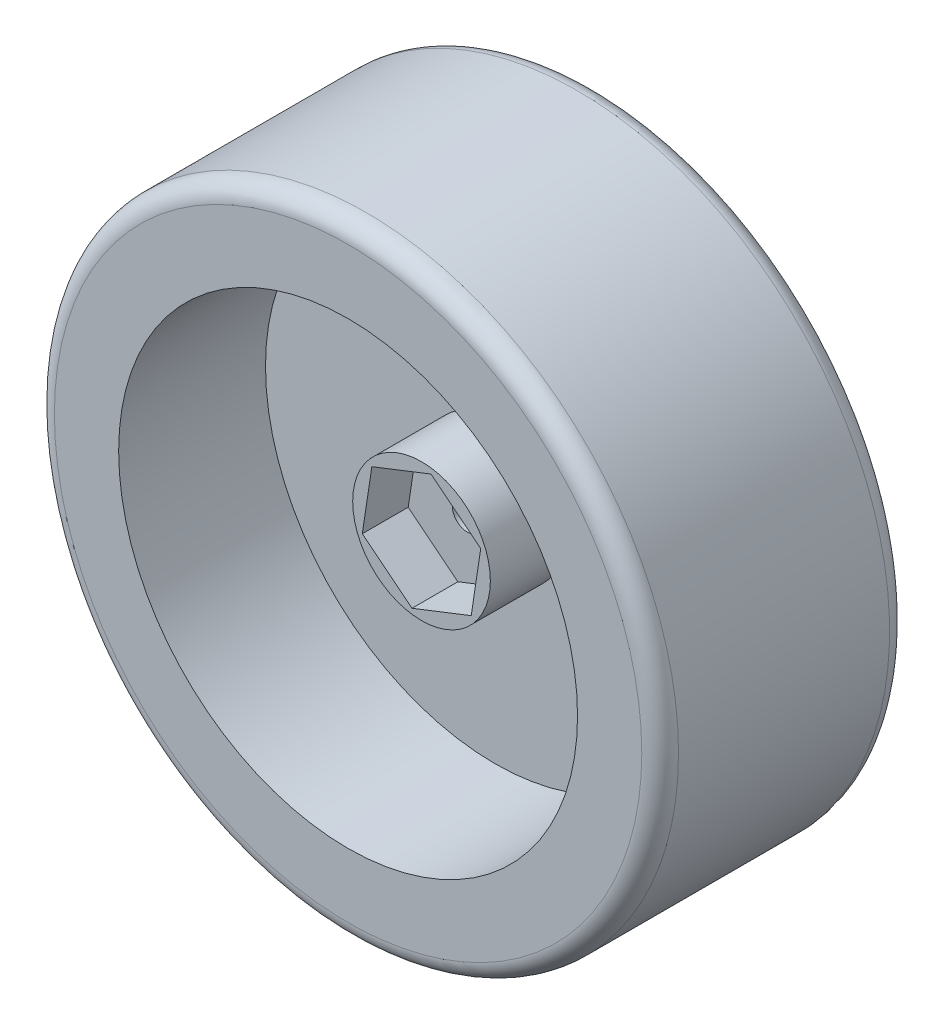
ISO-10303-21;
HEADER;
FILE_DESCRIPTION(('STEP AP214'),'2;1');
FILE_NAME('part.step','',(''),(''),'','','');
FILE_SCHEMA(('AUTOMOTIVE_DESIGN { 1 0 10303 214 1 1 1 1 }'));
ENDSEC;
DATA;
#1=APPLICATION_CONTEXT('core data for automotive mechanical design processes');
#2=APPLICATION_PROTOCOL_DEFINITION('international standard','automotive_design',2000,#1);
#3=PRODUCT_CONTEXT('',#1,'mechanical');
#4=PRODUCT('Part','Part','',(#3));
#5=PRODUCT_RELATED_PRODUCT_CATEGORY('part','',(#4));
#6=PRODUCT_DEFINITION_FORMATION('','',#4);
#7=PRODUCT_DEFINITION_CONTEXT('part definition',#1,'design');
#8=PRODUCT_DEFINITION('design','',#6,#7);
#9=PRODUCT_DEFINITION_SHAPE('','',#8);
#10=(LENGTH_UNIT() NAMED_UNIT(*) SI_UNIT(.MILLI.,.METRE.));
#11=(NAMED_UNIT(*) PLANE_ANGLE_UNIT() SI_UNIT($,.RADIAN.));
#12=(NAMED_UNIT(*) SI_UNIT($,.STERADIAN.) SOLID_ANGLE_UNIT());
#13=UNCERTAINTY_MEASURE_WITH_UNIT(LENGTH_MEASURE(1.E-05),#10,'distance_accuracy_value','');
#14=(GEOMETRIC_REPRESENTATION_CONTEXT(3) GLOBAL_UNCERTAINTY_ASSIGNED_CONTEXT((#13)) GLOBAL_UNIT_ASSIGNED_CONTEXT((#10,
#11,#12)) REPRESENTATION_CONTEXT('',''));
#15=CARTESIAN_POINT('',(0.,0.,0.));
#16=DIRECTION('',(0.,0.,1.));
#17=DIRECTION('',(1.,0.,0.));
#18=AXIS2_PLACEMENT_3D('',#15,#16,#17);
#19=CARTESIAN_POINT('',(0.,0.,27.));
#20=DIRECTION('',(0.,0.,-1.));
#21=DIRECTION('',(-1.,0.,0.));
#22=AXIS2_PLACEMENT_3D('',#19,#20,#21);
#23=CYLINDRICAL_SURFACE('',#22,34.);
#24=CARTESIAN_POINT('',(0.,0.,25.));
#25=DIRECTION('',(0.,0.,1.));
#26=DIRECTION('',(1.,0.,0.));
#27=AXIS2_PLACEMENT_3D('',#24,#25,#26);
#28=CIRCLE('',#27,34.);
#29=CARTESIAN_POINT('',(34.,0.,25.));
#30=VERTEX_POINT('',#29);
#31=EDGE_CURVE('E11',#30,#30,#28,.F.);
#32=ORIENTED_EDGE('',*,*,#31,.T.);
#33=EDGE_LOOP('',(#32));
#34=FACE_BOUND('',#33,.T.);
#35=CARTESIAN_POINT('',(0.,0.,2.));
#36=DIRECTION('',(0.,0.,-1.));
#37=DIRECTION('',(-1.,0.,0.));
#38=AXIS2_PLACEMENT_3D('',#35,#36,#37);
#39=CIRCLE('',#38,34.);
#40=CARTESIAN_POINT('',(-34.,0.,2.));
#41=VERTEX_POINT('',#40);
#42=EDGE_CURVE('E24',#41,#41,#39,.F.);
#43=ORIENTED_EDGE('',*,*,#42,.T.);
#44=EDGE_LOOP('',(#43));
#45=FACE_BOUND('',#44,.T.);
#46=ADVANCED_FACE('F17',(#34,#45),#23,.T.);
#47=CARTESIAN_POINT('',(34.,0.,27.));
#48=DIRECTION('',(0.,0.,1.));
#49=DIRECTION('',(1.,0.,0.));
#50=AXIS2_PLACEMENT_3D('',#47,#48,#49);
#51=PLANE('',#50);
#52=CARTESIAN_POINT('',(0.,0.,27.));
#53=DIRECTION('',(0.,0.,1.));
#54=DIRECTION('',(1.,0.,0.));
#55=AXIS2_PLACEMENT_3D('',#52,#53,#54);
#56=CIRCLE('',#55,32.);
#57=CARTESIAN_POINT('',(32.,0.,27.));
#58=VERTEX_POINT('',#57);
#59=EDGE_CURVE('E146',#58,#58,#56,.T.);
#60=ORIENTED_EDGE('',*,*,#59,.T.);
#61=EDGE_LOOP('',(#60));
#62=FACE_BOUND('',#61,.T.);
#63=CARTESIAN_POINT('',(0.,0.,27.));
#64=DIRECTION('',(0.,0.,1.));
#65=DIRECTION('',(1.,0.,0.));
#66=AXIS2_PLACEMENT_3D('',#63,#64,#65);
#67=CIRCLE('',#66,25.);
#68=CARTESIAN_POINT('',(25.,0.,27.));
#69=VERTEX_POINT('',#68);
#70=EDGE_CURVE('E143',#69,#69,#67,.T.);
#71=ORIENTED_EDGE('',*,*,#70,.F.);
#72=EDGE_LOOP('',(#71));
#73=FACE_BOUND('',#72,.T.);
#74=ADVANCED_FACE('F163',(#62,#73),#51,.T.);
#75=CARTESIAN_POINT('',(0.,0.,0.));
#76=DIRECTION('',(0.,0.,-1.));
#77=DIRECTION('',(-1.,0.,0.));
#78=AXIS2_PLACEMENT_3D('',#75,#76,#77);
#79=PLANE('',#78);
#80=CARTESIAN_POINT('',(0.,0.,0.));
#81=DIRECTION('',(0.,0.,-1.));
#82=DIRECTION('',(-1.,0.,0.));
#83=AXIS2_PLACEMENT_3D('',#80,#81,#82);
#84=CIRCLE('',#83,32.);
#85=CARTESIAN_POINT('',(-32.,0.,0.));
#86=VERTEX_POINT('',#85);
#87=EDGE_CURVE('E140',#86,#86,#84,.T.);
#88=ORIENTED_EDGE('',*,*,#87,.T.);
#89=EDGE_LOOP('',(#88));
#90=FACE_BOUND('',#89,.T.);
#91=CARTESIAN_POINT('',(0.,0.,0.));
#92=DIRECTION('',(0.,0.,-1.));
#93=DIRECTION('',(-1.,0.,0.));
#94=AXIS2_PLACEMENT_3D('',#91,#92,#93);
#95=CIRCLE('',#94,13.9999999999994);
#96=CARTESIAN_POINT('',(-13.9999999999994,0.,0.));
#97=VERTEX_POINT('',#96);
#98=EDGE_CURVE('E137',#97,#97,#95,.T.);
#99=ORIENTED_EDGE('',*,*,#98,.F.);
#100=EDGE_LOOP('',(#99));
#101=FACE_BOUND('',#100,.T.);
#102=ADVANCED_FACE('F159',(#90,#101),#79,.T.);
#103=CARTESIAN_POINT('',(0.,0.,11.));
#104=DIRECTION('',(0.,0.,-1.));
#105=DIRECTION('',(-1.,0.,0.));
#106=AXIS2_PLACEMENT_3D('',#103,#104,#105);
#107=PLANE('',#106);
#108=CARTESIAN_POINT('',(0.,0.,11.));
#109=DIRECTION('',(0.,0.,-1.));
#110=DIRECTION('',(-1.,0.,0.));
#111=AXIS2_PLACEMENT_3D('',#108,#109,#110);
#112=CIRCLE('',#111,7.5);
#113=CARTESIAN_POINT('',(-7.5,0.,11.));
#114=VERTEX_POINT('',#113);
#115=EDGE_CURVE('E134',#114,#114,#112,.F.);
#116=ORIENTED_EDGE('',*,*,#115,.F.);
#117=EDGE_LOOP('',(#116));
#118=FACE_BOUND('',#117,.T.);
#119=CARTESIAN_POINT('',(0.,0.,11.));
#120=DIRECTION('',(0.,0.,1.));
#121=DIRECTION('',(1.,0.,0.));
#122=AXIS2_PLACEMENT_3D('',#119,#120,#121);
#123=CIRCLE('',#122,25.);
#124=CARTESIAN_POINT('',(25.,0.,11.));
#125=VERTEX_POINT('',#124);
#126=EDGE_CURVE('E131',#125,#125,#123,.T.);
#127=ORIENTED_EDGE('',*,*,#126,.T.);
#128=EDGE_LOOP('',(#127));
#129=FACE_BOUND('',#128,.T.);
#130=ADVANCED_FACE('F162',(#118,#129),#107,.F.);
#131=CARTESIAN_POINT('',(0.,0.,27.));
#132=DIRECTION('',(0.,0.,1.));
#133=DIRECTION('',(1.,0.,0.));
#134=AXIS2_PLACEMENT_3D('',#131,#132,#133);
#135=CYLINDRICAL_SURFACE('',#134,25.);
#136=ORIENTED_EDGE('',*,*,#126,.F.);
#137=EDGE_LOOP('',(#136));
#138=FACE_BOUND('',#137,.T.);
#139=ORIENTED_EDGE('',*,*,#70,.T.);
#140=EDGE_LOOP('',(#139));
#141=FACE_BOUND('',#140,.T.);
#142=ADVANCED_FACE('F198',(#138,#141),#135,.F.);
#143=CARTESIAN_POINT('',(0.,0.,19.));
#144=DIRECTION('',(0.,0.,-1.));
#145=DIRECTION('',(-1.,0.,0.));
#146=AXIS2_PLACEMENT_3D('',#143,#144,#145);
#147=CYLINDRICAL_SURFACE('',#146,7.5);
#148=CARTESIAN_POINT('',(0.,0.,19.));
#149=DIRECTION('',(0.,0.,1.));
#150=DIRECTION('',(1.,0.,0.));
#151=AXIS2_PLACEMENT_3D('',#148,#149,#150);
#152=CIRCLE('',#151,7.5);
#153=CARTESIAN_POINT('',(7.5,0.,19.));
#154=VERTEX_POINT('',#153);
#155=EDGE_CURVE('E128',#154,#154,#152,.T.);
#156=ORIENTED_EDGE('',*,*,#155,.F.);
#157=EDGE_LOOP('',(#156));
#158=FACE_BOUND('',#157,.T.);
#159=ORIENTED_EDGE('',*,*,#115,.T.);
#160=EDGE_LOOP('',(#159));
#161=FACE_BOUND('',#160,.T.);
#162=ADVANCED_FACE('F202',(#158,#161),#147,.T.);
#163=CARTESIAN_POINT('',(0.,0.,19.));
#164=DIRECTION('',(0.,0.,1.));
#165=DIRECTION('',(1.,0.,0.));
#166=AXIS2_PLACEMENT_3D('',#163,#164,#165);
#167=PLANE('',#166);
#168=DIRECTION('',(-0.931103789340978,-0.364754346752539,0.));
#169=VECTOR('',#168,1.);
#170=CARTESIAN_POINT('',(1.0369120600019,6.85016885775987,19.));
#171=LINE('',#170,#169);
#172=CARTESIAN_POINT('',(1.0369120600019,6.85016885775987,19.));
#173=VERTEX_POINT('',#172);
#174=CARTESIAN_POINT('',(-5.41396422103197,4.32307661433192,19.));
#175=VERTEX_POINT('',#174);
#176=EDGE_CURVE('E31',#173,#175,#171,.T.);
#177=ORIENTED_EDGE('',*,*,#176,.F.);
#178=DIRECTION('',(-0.781438425098979,0.62398236175298,0.));
#179=VECTOR('',#178,1.);
#180=CARTESIAN_POINT('',(6.45087628103396,2.52709224342801,19.));
#181=LINE('',#180,#179);
#182=CARTESIAN_POINT('',(6.45087628103396,2.52709224342801,19.));
#183=VERTEX_POINT('',#182);
#184=EDGE_CURVE('E36',#183,#173,#181,.T.);
#185=ORIENTED_EDGE('',*,*,#184,.F.);
#186=DIRECTION('',(0.149665364242027,0.988736708505506,0.));
#187=VECTOR('',#186,1.);
#188=CARTESIAN_POINT('',(5.41396422103197,-4.32307661433192,19.));
#189=LINE('',#188,#187);
#190=CARTESIAN_POINT('',(5.41396422103197,-4.32307661433192,19.));
#191=VERTEX_POINT('',#190);
#192=EDGE_CURVE('E123',#191,#183,#189,.T.);
#193=ORIENTED_EDGE('',*,*,#192,.F.);
#194=DIRECTION('',(0.931103789340982,0.364754346752528,0.));
#195=VECTOR('',#194,1.);
#196=CARTESIAN_POINT('',(-1.03691206000179,-6.85016885775974,19.));
#197=LINE('',#196,#195);
#198=CARTESIAN_POINT('',(-1.03691206000179,-6.85016885775974,19.));
#199=VERTEX_POINT('',#198);
#200=EDGE_CURVE('E120',#199,#191,#197,.T.);
#201=ORIENTED_EDGE('',*,*,#200,.F.);
#202=DIRECTION('',(0.781438425098994,-0.623982361752961,0.));
#203=VECTOR('',#202,1.);
#204=CARTESIAN_POINT('',(-6.45087628103396,-2.52709224342801,19.));
#205=LINE('',#204,#203);
#206=CARTESIAN_POINT('',(-6.45087628103396,-2.52709224342801,19.));
#207=VERTEX_POINT('',#206);
#208=EDGE_CURVE('E118',#207,#199,#205,.T.);
#209=ORIENTED_EDGE('',*,*,#208,.F.);
#210=DIRECTION('',(-0.149665364242027,-0.988736708505506,0.));
#211=VECTOR('',#210,1.);
#212=CARTESIAN_POINT('',(-5.41396422103197,4.32307661433192,19.));
#213=LINE('',#212,#211);
#214=EDGE_CURVE('E87',#175,#207,#213,.T.);
#215=ORIENTED_EDGE('',*,*,#214,.F.);
#216=EDGE_LOOP('',(#177,#185,#193,#201,#209,#215));
#217=FACE_BOUND('',#216,.T.);
#218=ORIENTED_EDGE('',*,*,#155,.T.);
#219=EDGE_LOOP('',(#218));
#220=FACE_BOUND('',#219,.T.);
#221=ADVANCED_FACE('F206',(#217,#220),#167,.T.);
#222=CARTESIAN_POINT('',(1.0369120600019,6.85016885775987,14.));
#223=DIRECTION('',(-0.364754346752539,0.931103789340978,0.));
#224=DIRECTION('',(-0.931103789340978,-0.364754346752539,0.));
#225=AXIS2_PLACEMENT_3D('',#222,#223,#224);
#226=PLANE('',#225);
#227=ORIENTED_EDGE('',*,*,#176,.T.);
#228=DIRECTION('',(0.,0.,1.));
#229=VECTOR('',#228,1.);
#230=CARTESIAN_POINT('',(-5.41396422103197,4.32307661433192,14.));
#231=LINE('',#230,#229);
#232=CARTESIAN_POINT('',(-5.41396422103197,4.32307661433192,14.));
#233=VERTEX_POINT('',#232);
#234=EDGE_CURVE('E115',#233,#175,#231,.T.);
#235=ORIENTED_EDGE('',*,*,#234,.F.);
#236=DIRECTION('',(-0.931103789340978,-0.364754346752539,0.));
#237=VECTOR('',#236,1.);
#238=CARTESIAN_POINT('',(1.0369120600019,6.85016885775987,14.));
#239=LINE('',#238,#237);
#240=CARTESIAN_POINT('',(1.0369120600019,6.85016885775987,14.));
#241=VERTEX_POINT('',#240);
#242=EDGE_CURVE('E91',#241,#233,#239,.T.);
#243=ORIENTED_EDGE('',*,*,#242,.F.);
#244=DIRECTION('',(0.,0.,1.));
#245=VECTOR('',#244,1.);
#246=CARTESIAN_POINT('',(1.0369120600019,6.85016885775987,14.));
#247=LINE('',#246,#245);
#248=EDGE_CURVE('E112',#241,#173,#247,.T.);
#249=ORIENTED_EDGE('',*,*,#248,.T.);
#250=EDGE_LOOP('',(#227,#235,#243,#249));
#251=FACE_BOUND('',#250,.T.);
#252=ADVANCED_FACE('F210',(#251),#226,.F.);
#253=CARTESIAN_POINT('',(6.45087628103396,2.52709224342801,14.));
#254=DIRECTION('',(0.62398236175298,0.781438425098979,0.));
#255=DIRECTION('',(-0.781438425098979,0.62398236175298,0.));
#256=AXIS2_PLACEMENT_3D('',#253,#254,#255);
#257=PLANE('',#256);
#258=ORIENTED_EDGE('',*,*,#184,.T.);
#259=ORIENTED_EDGE('',*,*,#248,.F.);
#260=DIRECTION('',(-0.781438425098979,0.62398236175298,0.));
#261=VECTOR('',#260,1.);
#262=CARTESIAN_POINT('',(6.45087628103396,2.52709224342801,14.));
#263=LINE('',#262,#261);
#264=CARTESIAN_POINT('',(6.45087628103396,2.52709224342801,14.));
#265=VERTEX_POINT('',#264);
#266=EDGE_CURVE('E110',#265,#241,#263,.T.);
#267=ORIENTED_EDGE('',*,*,#266,.F.);
#268=DIRECTION('',(0.,0.,1.));
#269=VECTOR('',#268,1.);
#270=CARTESIAN_POINT('',(6.45087628103396,2.52709224342801,14.));
#271=LINE('',#270,#269);
#272=EDGE_CURVE('E108',#265,#183,#271,.T.);
#273=ORIENTED_EDGE('',*,*,#272,.T.);
#274=EDGE_LOOP('',(#258,#259,#267,#273));
#275=FACE_BOUND('',#274,.T.);
#276=ADVANCED_FACE('F213',(#275),#257,.F.);
#277=CARTESIAN_POINT('',(5.41396422103197,-4.32307661433192,14.));
#278=DIRECTION('',(0.988736708505506,-0.149665364242027,0.));
#279=DIRECTION('',(0.149665364242027,0.988736708505506,0.));
#280=AXIS2_PLACEMENT_3D('',#277,#278,#279);
#281=PLANE('',#280);
#282=ORIENTED_EDGE('',*,*,#192,.T.);
#283=ORIENTED_EDGE('',*,*,#272,.F.);
#284=DIRECTION('',(0.149665364242027,0.988736708505506,0.));
#285=VECTOR('',#284,1.);
#286=CARTESIAN_POINT('',(5.41396422103197,-4.32307661433192,14.));
#287=LINE('',#286,#285);
#288=CARTESIAN_POINT('',(5.41396422103197,-4.32307661433192,14.));
#289=VERTEX_POINT('',#288);
#290=EDGE_CURVE('E105',#289,#265,#287,.T.);
#291=ORIENTED_EDGE('',*,*,#290,.F.);
#292=DIRECTION('',(0.,0.,1.));
#293=VECTOR('',#292,1.);
#294=CARTESIAN_POINT('',(5.41396422103197,-4.32307661433192,14.));
#295=LINE('',#294,#293);
#296=EDGE_CURVE('E102',#289,#191,#295,.T.);
#297=ORIENTED_EDGE('',*,*,#296,.T.);
#298=EDGE_LOOP('',(#282,#283,#291,#297));
#299=FACE_BOUND('',#298,.T.);
#300=ADVANCED_FACE('F217',(#299),#281,.F.);
#301=CARTESIAN_POINT('',(-1.03691206000179,-6.85016885775974,14.));
#302=DIRECTION('',(0.364754346752528,-0.931103789340982,0.));
#303=DIRECTION('',(0.931103789340982,0.364754346752528,0.));
#304=AXIS2_PLACEMENT_3D('',#301,#302,#303);
#305=PLANE('',#304);
#306=ORIENTED_EDGE('',*,*,#200,.T.);
#307=ORIENTED_EDGE('',*,*,#296,.F.);
#308=DIRECTION('',(0.931103789340982,0.364754346752528,0.));
#309=VECTOR('',#308,1.);
#310=CARTESIAN_POINT('',(-1.03691206000179,-6.85016885775974,14.));
#311=LINE('',#310,#309);
#312=CARTESIAN_POINT('',(-1.03691206000179,-6.85016885775974,14.));
#313=VERTEX_POINT('',#312);
#314=EDGE_CURVE('E100',#313,#289,#311,.T.);
#315=ORIENTED_EDGE('',*,*,#314,.F.);
#316=DIRECTION('',(0.,0.,1.));
#317=VECTOR('',#316,1.);
#318=CARTESIAN_POINT('',(-1.03691206000179,-6.85016885775974,14.));
#319=LINE('',#318,#317);
#320=EDGE_CURVE('E76',#313,#199,#319,.T.);
#321=ORIENTED_EDGE('',*,*,#320,.T.);
#322=EDGE_LOOP('',(#306,#307,#315,#321));
#323=FACE_BOUND('',#322,.T.);
#324=ADVANCED_FACE('F221',(#323),#305,.F.);
#325=CARTESIAN_POINT('',(-6.45087628103396,-2.52709224342801,14.));
#326=DIRECTION('',(-0.623982361752961,-0.781438425098994,0.));
#327=DIRECTION('',(0.781438425098994,-0.623982361752961,0.));
#328=AXIS2_PLACEMENT_3D('',#325,#326,#327);
#329=PLANE('',#328);
#330=ORIENTED_EDGE('',*,*,#208,.T.);
#331=ORIENTED_EDGE('',*,*,#320,.F.);
#332=DIRECTION('',(0.781438425098994,-0.623982361752961,0.));
#333=VECTOR('',#332,1.);
#334=CARTESIAN_POINT('',(-6.45087628103396,-2.52709224342801,14.));
#335=LINE('',#334,#333);
#336=CARTESIAN_POINT('',(-6.45087628103396,-2.52709224342801,14.));
#337=VERTEX_POINT('',#336);
#338=EDGE_CURVE('E69',#337,#313,#335,.T.);
#339=ORIENTED_EDGE('',*,*,#338,.F.);
#340=DIRECTION('',(0.,0.,1.));
#341=VECTOR('',#340,1.);
#342=CARTESIAN_POINT('',(-6.45087628103396,-2.52709224342801,14.));
#343=LINE('',#342,#341);
#344=EDGE_CURVE('E73',#337,#207,#343,.T.);
#345=ORIENTED_EDGE('',*,*,#344,.T.);
#346=EDGE_LOOP('',(#330,#331,#339,#345));
#347=FACE_BOUND('',#346,.T.);
#348=ADVANCED_FACE('F72',(#347),#329,.F.);
#349=CARTESIAN_POINT('',(-5.41396422103197,4.32307661433192,14.));
#350=DIRECTION('',(-0.988736708505506,0.149665364242027,0.));
#351=DIRECTION('',(-0.149665364242027,-0.988736708505506,0.));
#352=AXIS2_PLACEMENT_3D('',#349,#350,#351);
#353=PLANE('',#352);
#354=ORIENTED_EDGE('',*,*,#214,.T.);
#355=ORIENTED_EDGE('',*,*,#344,.F.);
#356=DIRECTION('',(-0.149665364242027,-0.988736708505506,0.));
#357=VECTOR('',#356,1.);
#358=CARTESIAN_POINT('',(-5.41396422103197,4.32307661433192,14.));
#359=LINE('',#358,#357);
#360=EDGE_CURVE('E85',#233,#337,#359,.T.);
#361=ORIENTED_EDGE('',*,*,#360,.F.);
#362=ORIENTED_EDGE('',*,*,#234,.T.);
#363=EDGE_LOOP('',(#354,#355,#361,#362));
#364=FACE_BOUND('',#363,.T.);
#365=ADVANCED_FACE('F83',(#364),#353,.F.);
#366=CARTESIAN_POINT('',(0.,0.,14.));
#367=DIRECTION('',(0.,0.,1.));
#368=DIRECTION('',(1.,0.,0.));
#369=AXIS2_PLACEMENT_3D('',#366,#367,#368);
#370=PLANE('',#369);
#371=CARTESIAN_POINT('',(0.,0.,14.));
#372=DIRECTION('',(0.,0.,1.));
#373=DIRECTION('',(1.,0.,0.));
#374=AXIS2_PLACEMENT_3D('',#371,#372,#373);
#375=CIRCLE('',#374,1.65000000000001);
#376=CARTESIAN_POINT('',(1.65000000000001,0.,14.));
#377=VERTEX_POINT('',#376);
#378=EDGE_CURVE('E92',#377,#377,#375,.T.);
#379=ORIENTED_EDGE('',*,*,#378,.F.);
#380=EDGE_LOOP('',(#379));
#381=FACE_BOUND('',#380,.T.);
#382=ORIENTED_EDGE('',*,*,#242,.T.);
#383=ORIENTED_EDGE('',*,*,#360,.T.);
#384=ORIENTED_EDGE('',*,*,#338,.T.);
#385=ORIENTED_EDGE('',*,*,#314,.T.);
#386=ORIENTED_EDGE('',*,*,#290,.T.);
#387=ORIENTED_EDGE('',*,*,#266,.T.);
#388=EDGE_LOOP('',(#382,#383,#384,#385,#386,#387));
#389=FACE_BOUND('',#388,.T.);
#390=ADVANCED_FACE('F89',(#381,#389),#370,.T.);
#391=CARTESIAN_POINT('',(0.,0.,0.));
#392=DIRECTION('',(0.,0.,-1.));
#393=DIRECTION('',(-1.,0.,0.));
#394=AXIS2_PLACEMENT_3D('',#391,#392,#393);
#395=CYLINDRICAL_SURFACE('',#394,1.65000000000001);
#396=ORIENTED_EDGE('',*,*,#378,.T.);
#397=EDGE_LOOP('',(#396));
#398=FACE_BOUND('',#397,.T.);
#399=CARTESIAN_POINT('',(0.,0.,12.2916666666714));
#400=DIRECTION('',(0.,0.,-1.));
#401=DIRECTION('',(-1.,0.,0.));
#402=AXIS2_PLACEMENT_3D('',#399,#400,#401);
#403=CIRCLE('',#402,1.65000000000001);
#404=CARTESIAN_POINT('',(-1.65000000000001,0.,12.2916666666714));
#405=VERTEX_POINT('',#404);
#406=EDGE_CURVE('E95',#405,#405,#403,.T.);
#407=ORIENTED_EDGE('',*,*,#406,.T.);
#408=EDGE_LOOP('',(#407));
#409=FACE_BOUND('',#408,.T.);
#410=ADVANCED_FACE('F179',(#398,#409),#395,.F.);
#411=CARTESIAN_POINT('',(0.,0.,2.));
#412=DIRECTION('',(0.,0.,-1.));
#413=DIRECTION('',(-1.,0.,0.));
#414=AXIS2_PLACEMENT_3D('',#411,#412,#413);
#415=CONICAL_SURFACE('',#414,13.9999999999994,0.876058050597944);
#416=CARTESIAN_POINT('',(0.,0.,2.));
#417=DIRECTION('',(0.,0.,-1.));
#418=DIRECTION('',(-1.,0.,0.));
#419=AXIS2_PLACEMENT_3D('',#416,#417,#418);
#420=CIRCLE('',#419,13.9999999999994);
#421=CARTESIAN_POINT('',(-13.9999999999994,0.,2.));
#422=VERTEX_POINT('',#421);
#423=EDGE_CURVE('E241',#422,#422,#420,.T.);
#424=CARTESIAN_POINT('',(-1.65000000000001,0.,12.2916666666714));
#425=CARTESIAN_POINT('',(-1.77864583333333,0.,12.1844618055602));
#426=CARTESIAN_POINT('',(-1.90729166666666,0.,12.077256944449));
#427=CARTESIAN_POINT('',(-2.16458333333331,0.,11.8628472222267));
#428=CARTESIAN_POINT('',(-2.29322916666664,0.,11.7556423611156));
#429=CARTESIAN_POINT('',(-2.55052083333329,0.,11.5412326388932));
#430=CARTESIAN_POINT('',(-2.67916666666662,0.,11.4340277777821));
#431=CARTESIAN_POINT('',(-2.93645833333327,0.,11.2196180555598));
#432=CARTESIAN_POINT('',(-3.0651041666666,0.,11.1124131944486));
#433=CARTESIAN_POINT('',(-3.32239583333325,0.,10.8980034722263));
#434=CARTESIAN_POINT('',(-3.45104166666658,0.,10.7907986111151));
#435=CARTESIAN_POINT('',(-3.70833333333324,0.,10.5763888888928));
#436=CARTESIAN_POINT('',(-3.83697916666656,0.,10.4691840277816));
#437=CARTESIAN_POINT('',(-4.09427083333322,0.,10.2547743055593));
#438=CARTESIAN_POINT('',(-4.22291666666654,0.,10.1475694444482));
#439=CARTESIAN_POINT('',(-4.4802083333332,0.,9.93315972222585));
#440=CARTESIAN_POINT('',(-4.60885416666652,0.,9.82595486111468));
#441=CARTESIAN_POINT('',(-4.86614583333318,0.,9.61154513889237));
#442=CARTESIAN_POINT('',(-4.9947916666665,0.,9.50434027778121));
#443=CARTESIAN_POINT('',(-5.25208333333316,0.,9.28993055555889));
#444=CARTESIAN_POINT('',(-5.38072916666648,0.,9.18272569444772));
#445=CARTESIAN_POINT('',(-5.63802083333314,0.,8.9683159722254));
#446=CARTESIAN_POINT('',(-5.76666666666646,0.,8.86111111111424));
#447=CARTESIAN_POINT('',(-6.02395833333312,0.,8.64670138889192));
#448=CARTESIAN_POINT('',(-6.15260416666644,0.,8.53949652778076));
#449=CARTESIAN_POINT('',(-6.4098958333331,0.,8.32508680555844));
#450=CARTESIAN_POINT('',(-6.53854166666642,0.,8.21788194444728));
#451=CARTESIAN_POINT('',(-6.79583333333308,0.,8.00347222222496));
#452=CARTESIAN_POINT('',(-6.9244791666664,0.,7.8962673611138));
#453=CARTESIAN_POINT('',(-7.18177083333306,0.,7.68185763889148));
#454=CARTESIAN_POINT('',(-7.31041666666638,0.,7.57465277778032));
#455=CARTESIAN_POINT('',(-7.56770833333304,0.,7.360243055558));
#456=CARTESIAN_POINT('',(-7.69635416666636,0.,7.25303819444684));
#457=CARTESIAN_POINT('',(-7.95364583333302,0.,7.03862847222452));
#458=CARTESIAN_POINT('',(-8.08229166666634,0.,6.93142361111336));
#459=CARTESIAN_POINT('',(-8.339583333333,0.,6.71701388889104));
#460=CARTESIAN_POINT('',(-8.46822916666633,0.,6.60980902777988));
#461=CARTESIAN_POINT('',(-8.72552083333298,0.,6.39539930555756));
#462=CARTESIAN_POINT('',(-8.85416666666631,0.,6.2881944444464));
#463=CARTESIAN_POINT('',(-9.11145833333296,0.,6.07378472222408));
#464=CARTESIAN_POINT('',(-9.24010416666629,0.,5.96657986111292));
#465=CARTESIAN_POINT('',(-9.49739583333294,0.,5.7521701388906));
#466=CARTESIAN_POINT('',(-9.62604166666627,0.,5.64496527777944));
#467=CARTESIAN_POINT('',(-9.88333333333292,0.,5.43055555555712));
#468=CARTESIAN_POINT('',(-10.0119791666662,0.,5.32335069444596));
#469=CARTESIAN_POINT('',(-10.2692708333329,0.,5.10894097222364));
#470=CARTESIAN_POINT('',(-10.3979166666662,0.,5.00173611111248));
#471=CARTESIAN_POINT('',(-10.6552083333329,0.,4.78732638889016));
#472=CARTESIAN_POINT('',(-10.7838541666662,0.,4.680121527779));
#473=CARTESIAN_POINT('',(-11.0411458333329,0.,4.46571180555668));
#474=CARTESIAN_POINT('',(-11.1697916666662,0.,4.35850694444552));
#475=CARTESIAN_POINT('',(-11.4270833333328,0.,4.1440972222232));
#476=CARTESIAN_POINT('',(-11.5557291666662,0.,4.03689236111204));
#477=CARTESIAN_POINT('',(-11.8130208333328,0.,3.82248263888972));
#478=CARTESIAN_POINT('',(-11.9416666666661,0.,3.71527777777856));
#479=CARTESIAN_POINT('',(-12.1989583333328,0.,3.50086805555624));
#480=CARTESIAN_POINT('',(-12.3276041666661,0.,3.39366319444508));
#481=CARTESIAN_POINT('',(-12.5848958333328,0.,3.17925347222276));
#482=CARTESIAN_POINT('',(-12.7135416666661,0.,3.0720486111116));
#483=CARTESIAN_POINT('',(-12.9708333333328,0.,2.85763888888928));
#484=CARTESIAN_POINT('',(-13.0994791666661,0.,2.75043402777812));
#485=CARTESIAN_POINT('',(-13.3567708333327,0.,2.5360243055558));
#486=CARTESIAN_POINT('',(-13.4854166666661,0.,2.42881944444464));
#487=CARTESIAN_POINT('',(-13.7427083333327,0.,2.21440972222232));
#488=CARTESIAN_POINT('',(-13.8713541666661,0.,2.10720486111116));
#489=CARTESIAN_POINT('',(-13.9999999999994,0.,2.));
#490=B_SPLINE_CURVE_WITH_KNOTS('',3,(#424,#425,#426,#427,#428,#429,#430,#431,#432,#433,#434,
#435,#436,#437,#438,#439,#440,#441,#442,#443,#444,#445,#446,#447,#448,#449,#450,#451,#452,#453,
#454,#455,#456,#457,#458,#459,#460,#461,#462,#463,#464,#465,#466,#467,#468,#469,#470,#471,#472,
#473,#474,#475,#476,#477,#478,#479,#480,#481,#482,#483,#484,#485,#486,#487,#488,#489),
.UNSPECIFIED.,.F.,.F.,(4,2,2,2,2,2,2,2,2,2,2,2,2,2,2,2,2,2,2,2,2,2,2,2,2,2,2,2,2,2,2,2,4),(0.,
0.502378039049283,1.00475607809857,1.50713411714785,2.00951215619713,2.51189019524642,
3.0142682342957,3.51664627334498,4.01902431239426,4.52140235144355,5.02378039049283,
5.52615842954211,6.0285364685914,6.53091450764068,7.03329254668996,7.53567058573925,
8.03804862478853,8.54042666383781,9.04280470288709,9.54518274193638,10.0475607809857,
10.5499388200349,11.0523168590842,11.5546948981335,12.0570729371828,12.5594509762321,
13.0618290152814,13.5642070543306,14.0665850933799,14.5689631324292,15.0713411714785,
15.5737192105278,16.0760972495771),.UNSPECIFIED.);
#491=EDGE_CURVE('BSEAM169',#405,#422,#490,.T.);
#492=ORIENTED_EDGE('',*,*,#406,.F.);
#493=ORIENTED_EDGE('',*,*,#423,.T.);
#494=ORIENTED_EDGE('',*,*,#491,.T.);
#495=ORIENTED_EDGE('',*,*,#491,.F.);
#496=EDGE_LOOP('',(#492,#494,#493,#495));
#497=FACE_BOUND('',#496,.T.);
#498=ADVANCED_FACE('F169',(#497),#415,.F.);
#499=CARTESIAN_POINT('',(0.,0.,0.));
#500=DIRECTION('',(0.,0.,-1.));
#501=DIRECTION('',(-1.,0.,0.));
#502=AXIS2_PLACEMENT_3D('',#499,#500,#501);
#503=CYLINDRICAL_SURFACE('',#502,13.9999999999994);
#504=ORIENTED_EDGE('',*,*,#423,.F.);
#505=EDGE_LOOP('',(#504));
#506=FACE_BOUND('',#505,.T.);
#507=ORIENTED_EDGE('',*,*,#98,.T.);
#508=EDGE_LOOP('',(#507));
#509=FACE_BOUND('',#508,.T.);
#510=ADVANCED_FACE('F167',(#506,#509),#503,.F.);
#511=CARTESIAN_POINT('',(0.,0.,25.));
#512=DIRECTION('',(0.,0.,1.));
#513=DIRECTION('',(1.,0.,0.));
#514=AXIS2_PLACEMENT_3D('',#511,#512,#513);
#515=TOROIDAL_SURFACE('',#514,32.,2.);
#516=ORIENTED_EDGE('',*,*,#59,.F.);
#517=EDGE_LOOP('',(#516));
#518=FACE_BOUND('',#517,.T.);
#519=ORIENTED_EDGE('',*,*,#31,.F.);
#520=EDGE_LOOP('',(#519));
#521=FACE_BOUND('',#520,.T.);
#522=ADVANCED_FACE('F155',(#518,#521),#515,.T.);
#523=CARTESIAN_POINT('',(0.,0.,2.));
#524=DIRECTION('',(0.,0.,-1.));
#525=DIRECTION('',(-1.,0.,0.));
#526=AXIS2_PLACEMENT_3D('',#523,#524,#525);
#527=TOROIDAL_SURFACE('',#526,32.,2.);
#528=ORIENTED_EDGE('',*,*,#42,.F.);
#529=EDGE_LOOP('',(#528));
#530=FACE_BOUND('',#529,.T.);
#531=ORIENTED_EDGE('',*,*,#87,.F.);
#532=EDGE_LOOP('',(#531));
#533=FACE_BOUND('',#532,.T.);
#534=ADVANCED_FACE('F152',(#530,#533),#527,.T.);
#535=CLOSED_SHELL('',(#46,#74,#102,#130,#142,#162,#221,#252,#276,#300,#324,#348,#365,#390,#410,
#498,#510,#522,#534));
#536=MANIFOLD_SOLID_BREP('B1',#535);
#537=ADVANCED_BREP_SHAPE_REPRESENTATION('',(#18,#536),#14);
#538=SHAPE_DEFINITION_REPRESENTATION(#9,#537);
ENDSEC;
END-ISO-10303-21;
